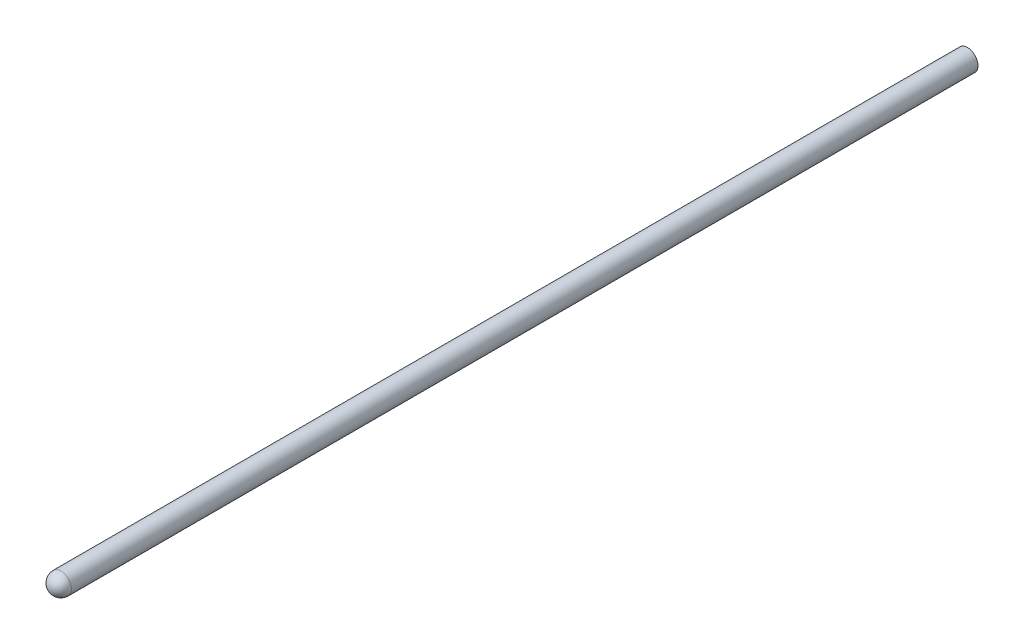
ISO-10303-21;
HEADER;
FILE_DESCRIPTION(('STEP AP214'),'2;1');
FILE_NAME('part.step','',(''),(''),'','','');
FILE_SCHEMA(('AUTOMOTIVE_DESIGN { 1 0 10303 214 1 1 1 1 }'));
ENDSEC;
DATA;
#1=APPLICATION_CONTEXT('core data for automotive mechanical design processes');
#2=APPLICATION_PROTOCOL_DEFINITION('international standard','automotive_design',2000,#1);
#3=PRODUCT_CONTEXT('',#1,'mechanical');
#4=PRODUCT('Part','Part','',(#3));
#5=PRODUCT_RELATED_PRODUCT_CATEGORY('part','',(#4));
#6=PRODUCT_DEFINITION_FORMATION('','',#4);
#7=PRODUCT_DEFINITION_CONTEXT('part definition',#1,'design');
#8=PRODUCT_DEFINITION('design','',#6,#7);
#9=PRODUCT_DEFINITION_SHAPE('','',#8);
#10=(LENGTH_UNIT() NAMED_UNIT(*) SI_UNIT(.MILLI.,.METRE.));
#11=(NAMED_UNIT(*) PLANE_ANGLE_UNIT() SI_UNIT($,.RADIAN.));
#12=(NAMED_UNIT(*) SI_UNIT($,.STERADIAN.) SOLID_ANGLE_UNIT());
#13=UNCERTAINTY_MEASURE_WITH_UNIT(LENGTH_MEASURE(1.E-05),#10,'distance_accuracy_value','');
#14=(GEOMETRIC_REPRESENTATION_CONTEXT(3) GLOBAL_UNCERTAINTY_ASSIGNED_CONTEXT((#13)) GLOBAL_UNIT_ASSIGNED_CONTEXT((#10,
#11,#12)) REPRESENTATION_CONTEXT('',''));
#15=CARTESIAN_POINT('',(0.,0.,0.));
#16=DIRECTION('',(0.,0.,1.));
#17=DIRECTION('',(1.,0.,0.));
#18=AXIS2_PLACEMENT_3D('',#15,#16,#17);
#19=CARTESIAN_POINT('',(0.,0.,-273.05));
#20=DIRECTION('',(0.,0.,1.));
#21=DIRECTION('',(1.,0.,0.));
#22=AXIS2_PLACEMENT_3D('',#19,#20,#21);
#23=CYLINDRICAL_SURFACE('',#22,6.35);
#24=CARTESIAN_POINT('',(0.,0.,-273.05));
#25=DIRECTION('',(0.,0.,1.));
#26=DIRECTION('',(1.,0.,0.));
#27=AXIS2_PLACEMENT_3D('',#24,#25,#26);
#28=CIRCLE('',#27,6.35);
#29=CARTESIAN_POINT('',(6.35,0.,-273.05));
#30=VERTEX_POINT('',#29);
#31=EDGE_CURVE('E10',#30,#30,#28,.T.);
#32=ORIENTED_EDGE('',*,*,#31,.T.);
#33=EDGE_LOOP('',(#32));
#34=FACE_BOUND('',#33,.T.);
#35=CARTESIAN_POINT('',(0.,0.,273.05));
#36=DIRECTION('',(0.,0.,1.));
#37=DIRECTION('',(1.,0.,0.));
#38=AXIS2_PLACEMENT_3D('',#35,#36,#37);
#39=CIRCLE('',#38,6.35);
#40=CARTESIAN_POINT('',(6.35,0.,273.05));
#41=VERTEX_POINT('',#40);
#42=EDGE_CURVE('E34',#41,#41,#39,.T.);
#43=ORIENTED_EDGE('',*,*,#42,.F.);
#44=EDGE_LOOP('',(#43));
#45=FACE_BOUND('',#44,.T.);
#46=ADVANCED_FACE('F30',(#34,#45),#23,.T.);
#47=CARTESIAN_POINT('',(0.,0.,-273.05));
#48=DIRECTION('',(0.,0.,1.));
#49=DIRECTION('',(1.,0.,0.));
#50=AXIS2_PLACEMENT_3D('',#47,#48,#49);
#51=PLANE('',#50);
#52=ORIENTED_EDGE('',*,*,#31,.F.);
#53=EDGE_LOOP('',(#52));
#54=FACE_BOUND('',#53,.T.);
#55=ADVANCED_FACE('F45',(#54),#51,.F.);
#56=CARTESIAN_POINT('',(0.,0.,273.05));
#57=DIRECTION('',(0.,0.,1.));
#58=DIRECTION('',(1.,0.,0.));
#59=AXIS2_PLACEMENT_3D('',#56,#57,#58);
#60=SPHERICAL_SURFACE('',#59,6.35);
#61=ORIENTED_EDGE('',*,*,#42,.T.);
#62=EDGE_LOOP('',(#61));
#63=FACE_BOUND('',#62,.T.);
#64=ADVANCED_FACE('F32',(#63),#60,.T.);
#65=CLOSED_SHELL('',(#46,#55,#64));
#66=MANIFOLD_SOLID_BREP('B2',#65);
#67=ADVANCED_BREP_SHAPE_REPRESENTATION('',(#18,#66),#14);
#68=SHAPE_DEFINITION_REPRESENTATION(#9,#67);
ENDSEC;
END-ISO-10303-21;
